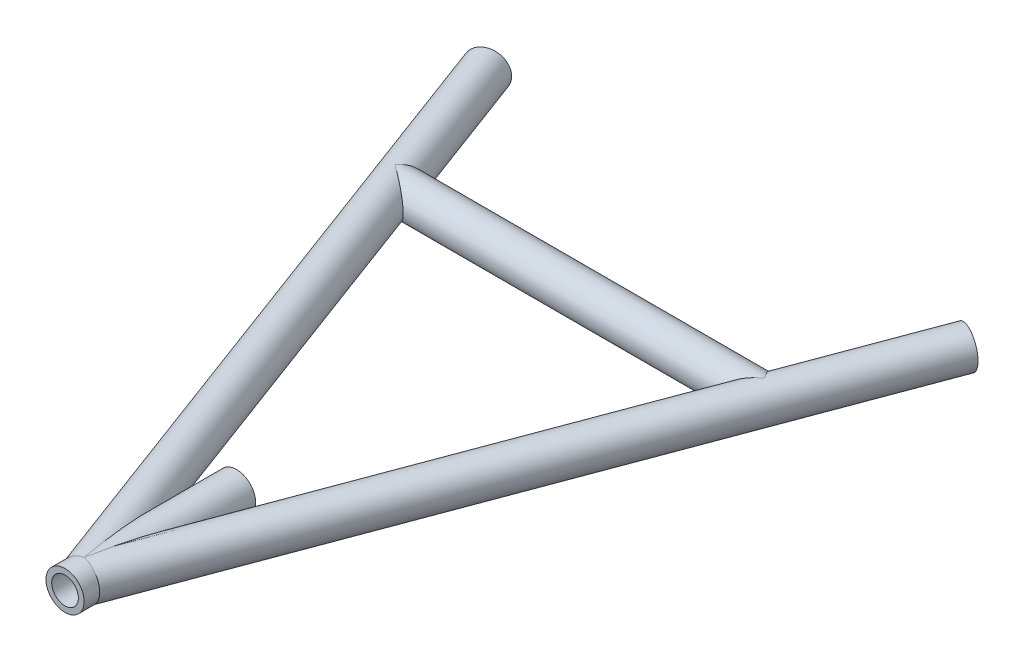
ISO-10303-21;
HEADER;
FILE_DESCRIPTION(('STEP AP214'),'2;1');
FILE_NAME('part.step','',(''),(''),'','','');
FILE_SCHEMA(('AUTOMOTIVE_DESIGN { 1 0 10303 214 1 1 1 1 }'));
ENDSEC;
DATA;
#1=APPLICATION_CONTEXT('core data for automotive mechanical design processes');
#2=APPLICATION_PROTOCOL_DEFINITION('international standard','automotive_design',2000,#1);
#3=PRODUCT_CONTEXT('',#1,'mechanical');
#4=PRODUCT('Part','Part','',(#3));
#5=PRODUCT_RELATED_PRODUCT_CATEGORY('part','',(#4));
#6=PRODUCT_DEFINITION_FORMATION('','',#4);
#7=PRODUCT_DEFINITION_CONTEXT('part definition',#1,'design');
#8=PRODUCT_DEFINITION('design','',#6,#7);
#9=PRODUCT_DEFINITION_SHAPE('','',#8);
#10=(LENGTH_UNIT() NAMED_UNIT(*) SI_UNIT(.MILLI.,.METRE.));
#11=(NAMED_UNIT(*) PLANE_ANGLE_UNIT() SI_UNIT($,.RADIAN.));
#12=(NAMED_UNIT(*) SI_UNIT($,.STERADIAN.) SOLID_ANGLE_UNIT());
#13=UNCERTAINTY_MEASURE_WITH_UNIT(LENGTH_MEASURE(1.E-05),#10,'distance_accuracy_value','');
#14=(GEOMETRIC_REPRESENTATION_CONTEXT(3) GLOBAL_UNCERTAINTY_ASSIGNED_CONTEXT((#13)) GLOBAL_UNIT_ASSIGNED_CONTEXT((#10,
#11,#12)) REPRESENTATION_CONTEXT('',''));
#15=CARTESIAN_POINT('',(0.,0.,0.));
#16=DIRECTION('',(0.,0.,1.));
#17=DIRECTION('',(1.,0.,0.));
#18=AXIS2_PLACEMENT_3D('',#15,#16,#17);
#19=CARTESIAN_POINT('',(5.,0.,4.99999999999998));
#20=DIRECTION('',(0.,0.,1.));
#21=DIRECTION('',(1.,0.,0.));
#22=AXIS2_PLACEMENT_3D('',#19,#20,#21);
#23=PLANE('',#22);
#24=CARTESIAN_POINT('',(0.,0.,4.99999999999998));
#25=DIRECTION('',(0.,0.,1.));
#26=DIRECTION('',(1.,0.,0.));
#27=AXIS2_PLACEMENT_3D('',#24,#25,#26);
#28=CIRCLE('',#27,3.5);
#29=CARTESIAN_POINT('',(3.49999999999996,0.,4.99999999999998));
#30=VERTEX_POINT('',#29);
#31=EDGE_CURVE('E187',#30,#30,#28,.T.);
#32=ORIENTED_EDGE('',*,*,#31,.F.);
#33=EDGE_LOOP('',(#32));
#34=FACE_BOUND('',#33,.T.);
#35=CARTESIAN_POINT('',(0.,0.,4.99999999999998));
#36=DIRECTION('',(0.,0.,1.));
#37=DIRECTION('',(1.,0.,0.));
#38=AXIS2_PLACEMENT_3D('',#35,#36,#37);
#39=CIRCLE('',#38,5.);
#40=CARTESIAN_POINT('',(5.,0.,4.99999999999998));
#41=VERTEX_POINT('',#40);
#42=EDGE_CURVE('E124',#41,#41,#39,.T.);
#43=ORIENTED_EDGE('',*,*,#42,.T.);
#44=EDGE_LOOP('',(#43));
#45=FACE_BOUND('',#44,.T.);
#46=ADVANCED_FACE('F66',(#34,#45),#23,.T.);
#47=CARTESIAN_POINT('',(-62.9177954880747,0.,-168.645637390716));
#48=DIRECTION('',(0.349543308267082,0.,0.936920207726199));
#49=DIRECTION('',(0.936920207726199,0.,-0.349543308267082));
#50=AXIS2_PLACEMENT_3D('',#47,#48,#49);
#51=PLANE('',#50);
#52=CARTESIAN_POINT('',(-62.9177954880747,0.,-168.645637390716));
#53=DIRECTION('',(-0.349543308267082,0.,-0.936920207726199));
#54=DIRECTION('',(-0.936920207726199,0.,0.349543308267082));
#55=AXIS2_PLACEMENT_3D('',#52,#53,#54);
#56=CIRCLE('',#55,3.50000000000001);
#57=CARTESIAN_POINT('',(-66.1970162151164,0.,-167.422235811781));
#58=VERTEX_POINT('',#57);
#59=EDGE_CURVE('E191',#58,#58,#56,.T.);
#60=ORIENTED_EDGE('',*,*,#59,.F.);
#61=EDGE_LOOP('',(#60));
#62=FACE_BOUND('',#61,.T.);
#63=CARTESIAN_POINT('',(-62.9177954880747,0.,-168.645637390716));
#64=DIRECTION('',(0.349543308267082,0.,0.936920207726199));
#65=DIRECTION('',(0.936920207726199,0.,-0.349543308267082));
#66=AXIS2_PLACEMENT_3D('',#63,#64,#65);
#67=CIRCLE('',#66,5.);
#68=CARTESIAN_POINT('',(-58.2331944494438,0.,-170.393353932051));
#69=VERTEX_POINT('',#68);
#70=EDGE_CURVE('E111',#69,#69,#67,.T.);
#71=ORIENTED_EDGE('',*,*,#70,.F.);
#72=EDGE_LOOP('',(#71));
#73=FACE_BOUND('',#72,.T.);
#74=ADVANCED_FACE('F104',(#62,#73),#51,.F.);
#75=CARTESIAN_POINT('',(5.1880154733208,0.,13.9060208563238));
#76=DIRECTION('',(-0.349543308267082,0.,-0.936920207726199));
#77=DIRECTION('',(-0.936920207726199,0.,0.349543308267082));
#78=AXIS2_PLACEMENT_3D('',#75,#76,#77);
#79=CYLINDRICAL_SURFACE('',#78,5.);
#80=CARTESIAN_POINT('',(-48.5,0.,-130.));
#81=DIRECTION('',(0.570287949957264,0.,-0.821444857634121));
#82=DIRECTION('',(-0.821444857634121,0.,-0.570287949957264));
#83=AXIS2_PLACEMENT_3D('',#80,#81,#82);
#84=ELLIPSE('',#83,8.76750069920764,5.);
#85=CARTESIAN_POINT('',(-48.5,-5.,-130.));
#86=VERTEX_POINT('',#85);
#87=CARTESIAN_POINT('',(-48.5,5.,-130.));
#88=VERTEX_POINT('',#87);
#89=EDGE_CURVE('E13',#86,#88,#84,.F.);
#90=ORIENTED_EDGE('',*,*,#89,.T.);
#91=CARTESIAN_POINT('',(-48.5,0.,-130.));
#92=DIRECTION('',(-0.821444857634121,0.,-0.570287949957264));
#93=DIRECTION('',(0.570287949957264,0.,-0.821444857634121));
#94=AXIS2_PLACEMENT_3D('',#91,#92,#93);
#95=ELLIPSE('',#94,6.08683583996219,5.);
#96=EDGE_CURVE('E75',#88,#86,#95,.T.);
#97=ORIENTED_EDGE('',*,*,#96,.T.);
#98=EDGE_LOOP('',(#90,#97));
#99=FACE_BOUND('',#98,.T.);
#100=CARTESIAN_POINT('',(0.,0.,0.));
#101=DIRECTION('',(-0.177594752560149,0.,-0.984103705847661));
#102=DIRECTION('',(-0.984103705847661,0.,0.177594752560149));
#103=AXIS2_PLACEMENT_3D('',#100,#101,#102);
#104=ELLIPSE('',#103,5.08076534036952,5.);
#105=CARTESIAN_POINT('',(0.,-5.,1.87350135405495E-13));
#106=VERTEX_POINT('',#105);
#107=CARTESIAN_POINT('',(0.,5.,0.));
#108=VERTEX_POINT('',#107);
#109=EDGE_CURVE('E108',#106,#108,#104,.T.);
#110=ORIENTED_EDGE('',*,*,#109,.T.);
#111=CARTESIAN_POINT('',(0.,0.,0.));
#112=DIRECTION('',(-0.984103705847661,0.,0.177594752560149));
#113=DIRECTION('',(-0.177594752560149,0.,-0.984103705847661));
#114=AXIS2_PLACEMENT_3D('',#111,#112,#113);
#115=ELLIPSE('',#114,28.1539850019305,5.);
#116=EDGE_CURVE('E113',#108,#106,#115,.T.);
#117=ORIENTED_EDGE('',*,*,#116,.T.);
#118=EDGE_LOOP('',(#110,#117));
#119=FACE_BOUND('',#118,.T.);
#120=ORIENTED_EDGE('',*,*,#70,.T.);
#121=EDGE_LOOP('',(#120));
#122=FACE_BOUND('',#121,.T.);
#123=ADVANCED_FACE('F68',(#99,#119,#122),#79,.T.);
#124=CARTESIAN_POINT('',(0.,0.,-40.));
#125=DIRECTION('',(0.,0.,1.));
#126=DIRECTION('',(1.,0.,0.));
#127=AXIS2_PLACEMENT_3D('',#124,#125,#126);
#128=PLANE('',#127);
#129=CARTESIAN_POINT('',(0.,0.,-40.));
#130=DIRECTION('',(0.,0.,1.));
#131=DIRECTION('',(1.,0.,0.));
#132=AXIS2_PLACEMENT_3D('',#129,#130,#131);
#133=CIRCLE('',#132,3.5);
#134=CARTESIAN_POINT('',(3.49999999999996,0.,-40.));
#135=VERTEX_POINT('',#134);
#136=EDGE_CURVE('E70',#135,#135,#133,.T.);
#137=ORIENTED_EDGE('',*,*,#136,.T.);
#138=EDGE_LOOP('',(#137));
#139=FACE_BOUND('',#138,.T.);
#140=CARTESIAN_POINT('',(0.,0.,-40.));
#141=DIRECTION('',(0.,0.,1.));
#142=DIRECTION('',(1.,0.,0.));
#143=AXIS2_PLACEMENT_3D('',#140,#141,#142);
#144=CIRCLE('',#143,5.);
#145=CARTESIAN_POINT('',(5.,0.,-40.));
#146=VERTEX_POINT('',#145);
#147=EDGE_CURVE('E99',#146,#146,#144,.T.);
#148=ORIENTED_EDGE('',*,*,#147,.F.);
#149=EDGE_LOOP('',(#148));
#150=FACE_BOUND('',#149,.T.);
#151=ADVANCED_FACE('F103',(#139,#150),#128,.F.);
#152=CARTESIAN_POINT('',(0.,0.,-40.));
#153=DIRECTION('',(0.,0.,1.));
#154=DIRECTION('',(1.,0.,0.));
#155=AXIS2_PLACEMENT_3D('',#152,#153,#154);
#156=CYLINDRICAL_SURFACE('',#155,5.);
#157=ORIENTED_EDGE('',*,*,#147,.T.);
#158=EDGE_LOOP('',(#157));
#159=FACE_BOUND('',#158,.T.);
#160=ORIENTED_EDGE('',*,*,#116,.F.);
#161=CARTESIAN_POINT('',(0.,0.,1.87350135405495E-13));
#162=DIRECTION('',(-0.984103705847661,0.,-0.177594752560149));
#163=DIRECTION('',(-0.177594752560149,0.,0.984103705847661));
#164=AXIS2_PLACEMENT_3D('',#161,#162,#163);
#165=ELLIPSE('',#164,28.1539850019305,5.);
#166=EDGE_CURVE('E118',#106,#108,#165,.F.);
#167=ORIENTED_EDGE('',*,*,#166,.F.);
#168=EDGE_LOOP('',(#160,#167));
#169=FACE_BOUND('',#168,.T.);
#170=ADVANCED_FACE('F130',(#159,#169),#156,.T.);
#171=ORIENTED_EDGE('',*,*,#42,.F.);
#172=EDGE_LOOP('',(#171));
#173=FACE_BOUND('',#172,.T.);
#174=ORIENTED_EDGE('',*,*,#109,.F.);
#175=CARTESIAN_POINT('',(0.,0.,1.87350135405495E-13));
#176=DIRECTION('',(-0.177594752560149,0.,0.984103705847661));
#177=DIRECTION('',(-0.984103705847661,0.,-0.177594752560149));
#178=AXIS2_PLACEMENT_3D('',#175,#176,#177);
#179=ELLIPSE('',#178,5.08076534036952,5.);
#180=EDGE_CURVE('E181',#108,#106,#179,.F.);
#181=ORIENTED_EDGE('',*,*,#180,.F.);
#182=EDGE_LOOP('',(#174,#181));
#183=FACE_BOUND('',#182,.T.);
#184=ADVANCED_FACE('F141',(#173,#183),#156,.T.);
#185=CARTESIAN_POINT('',(62.9177954880747,0.,-168.645637390716));
#186=DIRECTION('',(0.349543308267082,0.,-0.936920207726199));
#187=DIRECTION('',(-0.936920207726199,0.,-0.349543308267082));
#188=AXIS2_PLACEMENT_3D('',#185,#186,#187);
#189=PLANE('',#188);
#190=CARTESIAN_POINT('',(62.9177954880748,0.,-168.645637390716));
#191=DIRECTION('',(0.349543308267082,0.,-0.936920207726199));
#192=DIRECTION('',(-0.936920207726199,0.,-0.349543308267082));
#193=AXIS2_PLACEMENT_3D('',#190,#191,#192);
#194=CIRCLE('',#193,3.49999999999998);
#195=CARTESIAN_POINT('',(59.6385747610331,0.,-169.869038969651));
#196=VERTEX_POINT('',#195);
#197=EDGE_CURVE('E173',#196,#196,#194,.T.);
#198=ORIENTED_EDGE('',*,*,#197,.F.);
#199=EDGE_LOOP('',(#198));
#200=FACE_BOUND('',#199,.T.);
#201=CARTESIAN_POINT('',(62.9177954880747,0.,-168.645637390716));
#202=DIRECTION('',(0.349543308267082,0.,-0.936920207726199));
#203=DIRECTION('',(-0.936920207726199,0.,-0.349543308267082));
#204=AXIS2_PLACEMENT_3D('',#201,#202,#203);
#205=CIRCLE('',#204,5.);
#206=CARTESIAN_POINT('',(58.2331944494437,0.,-170.393353932051));
#207=VERTEX_POINT('',#206);
#208=EDGE_CURVE('E114',#207,#207,#205,.T.);
#209=ORIENTED_EDGE('',*,*,#208,.T.);
#210=EDGE_LOOP('',(#209));
#211=FACE_BOUND('',#210,.T.);
#212=ADVANCED_FACE('F158',(#200,#211),#189,.T.);
#213=CARTESIAN_POINT('',(62.9177954880747,0.,-168.645637390716));
#214=DIRECTION('',(-0.349543308267082,0.,0.936920207726199));
#215=DIRECTION('',(0.936920207726199,0.,0.349543308267082));
#216=AXIS2_PLACEMENT_3D('',#213,#214,#215);
#217=CYLINDRICAL_SURFACE('',#216,5.);
#218=CARTESIAN_POINT('',(48.5,0.,-130.));
#219=DIRECTION('',(0.570287949957264,0.,0.821444857634121));
#220=DIRECTION('',(-0.821444857634121,0.,0.570287949957264));
#221=AXIS2_PLACEMENT_3D('',#218,#219,#220);
#222=ELLIPSE('',#221,8.76750069920764,5.);
#223=CARTESIAN_POINT('',(48.5,5.,-130.));
#224=VERTEX_POINT('',#223);
#225=CARTESIAN_POINT('',(48.5,-5.,-130.));
#226=VERTEX_POINT('',#225);
#227=EDGE_CURVE('E86',#224,#226,#222,.T.);
#228=ORIENTED_EDGE('',*,*,#227,.T.);
#229=CARTESIAN_POINT('',(48.5,0.,-130.));
#230=DIRECTION('',(-0.821444857634121,0.,0.570287949957264));
#231=DIRECTION('',(0.570287949957264,0.,0.821444857634121));
#232=AXIS2_PLACEMENT_3D('',#229,#230,#231);
#233=ELLIPSE('',#232,6.08683583996219,5.);
#234=EDGE_CURVE('E183',#226,#224,#233,.F.);
#235=ORIENTED_EDGE('',*,*,#234,.T.);
#236=EDGE_LOOP('',(#228,#235));
#237=FACE_BOUND('',#236,.T.);
#238=ORIENTED_EDGE('',*,*,#208,.F.);
#239=EDGE_LOOP('',(#238));
#240=FACE_BOUND('',#239,.T.);
#241=ORIENTED_EDGE('',*,*,#166,.T.);
#242=ORIENTED_EDGE('',*,*,#180,.T.);
#243=EDGE_LOOP('',(#241,#242));
#244=FACE_BOUND('',#243,.T.);
#245=ADVANCED_FACE('F160',(#237,#240,#244),#217,.T.);
#246=CARTESIAN_POINT('',(48.5,0.,-130.));
#247=DIRECTION('',(-1.,0.,0.));
#248=DIRECTION('',(0.,0.,1.));
#249=AXIS2_PLACEMENT_3D('',#246,#247,#248);
#250=CYLINDRICAL_SURFACE('',#249,5.);
#251=ORIENTED_EDGE('',*,*,#234,.F.);
#252=ORIENTED_EDGE('',*,*,#227,.F.);
#253=EDGE_LOOP('',(#251,#252));
#254=FACE_BOUND('',#253,.T.);
#255=ORIENTED_EDGE('',*,*,#96,.F.);
#256=ORIENTED_EDGE('',*,*,#89,.F.);
#257=EDGE_LOOP('',(#255,#256));
#258=FACE_BOUND('',#257,.T.);
#259=ADVANCED_FACE('F97',(#254,#258),#250,.T.);
#260=CARTESIAN_POINT('',(0.,0.,-44.));
#261=DIRECTION('',(0.,0.,1.));
#262=DIRECTION('',(1.,0.,0.));
#263=AXIS2_PLACEMENT_3D('',#260,#261,#262);
#264=CYLINDRICAL_SURFACE('',#263,3.5);
#265=CARTESIAN_POINT('',(3.49999999999996,0.,4.99999999999998));
#266=CARTESIAN_POINT('',(3.49999999999996,0.,4.53124999999998));
#267=CARTESIAN_POINT('',(3.49999999999996,0.,4.06249999999998));
#268=CARTESIAN_POINT('',(3.49999999999996,0.,3.12499999999998));
#269=CARTESIAN_POINT('',(3.49999999999996,0.,2.65624999999998));
#270=CARTESIAN_POINT('',(3.49999999999996,0.,1.71874999999998));
#271=CARTESIAN_POINT('',(3.49999999999996,0.,1.24999999999998));
#272=CARTESIAN_POINT('',(3.49999999999996,0.,0.312499999999984));
#273=CARTESIAN_POINT('',(3.49999999999996,0.,-0.156250000000015));
#274=CARTESIAN_POINT('',(3.49999999999996,0.,-1.09375000000001));
#275=CARTESIAN_POINT('',(3.49999999999996,0.,-1.56250000000001));
#276=CARTESIAN_POINT('',(3.49999999999996,0.,-2.50000000000001));
#277=CARTESIAN_POINT('',(3.49999999999996,0.,-2.96875000000002));
#278=CARTESIAN_POINT('',(3.49999999999996,0.,-3.90625000000002));
#279=CARTESIAN_POINT('',(3.49999999999996,0.,-4.37500000000002));
#280=CARTESIAN_POINT('',(3.49999999999996,0.,-5.31250000000001));
#281=CARTESIAN_POINT('',(3.49999999999996,0.,-5.78125000000001));
#282=CARTESIAN_POINT('',(3.49999999999996,0.,-6.71875000000001));
#283=CARTESIAN_POINT('',(3.49999999999996,0.,-7.18750000000001));
#284=CARTESIAN_POINT('',(3.49999999999996,0.,-8.12500000000001));
#285=CARTESIAN_POINT('',(3.49999999999996,0.,-8.59375000000001));
#286=CARTESIAN_POINT('',(3.49999999999996,0.,-9.53125000000001));
#287=CARTESIAN_POINT('',(3.49999999999996,0.,-10.));
#288=CARTESIAN_POINT('',(3.49999999999996,0.,-10.9375));
#289=CARTESIAN_POINT('',(3.49999999999996,0.,-11.40625));
#290=CARTESIAN_POINT('',(3.49999999999996,0.,-12.34375));
#291=CARTESIAN_POINT('',(3.49999999999996,0.,-12.8125));
#292=CARTESIAN_POINT('',(3.49999999999996,0.,-13.75));
#293=CARTESIAN_POINT('',(3.49999999999996,0.,-14.21875));
#294=CARTESIAN_POINT('',(3.49999999999996,0.,-15.15625));
#295=CARTESIAN_POINT('',(3.49999999999996,0.,-15.625));
#296=CARTESIAN_POINT('',(3.49999999999996,0.,-16.5625));
#297=CARTESIAN_POINT('',(3.49999999999996,0.,-17.03125));
#298=CARTESIAN_POINT('',(3.49999999999996,0.,-17.96875));
#299=CARTESIAN_POINT('',(3.49999999999996,0.,-18.4375));
#300=CARTESIAN_POINT('',(3.49999999999996,0.,-19.375));
#301=CARTESIAN_POINT('',(3.49999999999996,0.,-19.84375));
#302=CARTESIAN_POINT('',(3.49999999999996,0.,-20.78125));
#303=CARTESIAN_POINT('',(3.49999999999996,0.,-21.25));
#304=CARTESIAN_POINT('',(3.49999999999996,0.,-22.1875));
#305=CARTESIAN_POINT('',(3.49999999999996,0.,-22.65625));
#306=CARTESIAN_POINT('',(3.49999999999996,0.,-23.59375));
#307=CARTESIAN_POINT('',(3.49999999999996,0.,-24.0625));
#308=CARTESIAN_POINT('',(3.49999999999996,0.,-25.));
#309=CARTESIAN_POINT('',(3.49999999999996,0.,-25.46875));
#310=CARTESIAN_POINT('',(3.49999999999996,0.,-26.40625));
#311=CARTESIAN_POINT('',(3.49999999999996,0.,-26.875));
#312=CARTESIAN_POINT('',(3.49999999999996,0.,-27.8125));
#313=CARTESIAN_POINT('',(3.49999999999996,0.,-28.28125));
#314=CARTESIAN_POINT('',(3.49999999999996,0.,-29.21875));
#315=CARTESIAN_POINT('',(3.49999999999996,0.,-29.6875));
#316=CARTESIAN_POINT('',(3.49999999999996,0.,-30.625));
#317=CARTESIAN_POINT('',(3.49999999999996,0.,-31.09375));
#318=CARTESIAN_POINT('',(3.49999999999996,0.,-32.03125));
#319=CARTESIAN_POINT('',(3.49999999999996,0.,-32.5));
#320=CARTESIAN_POINT('',(3.49999999999996,0.,-33.4375));
#321=CARTESIAN_POINT('',(3.49999999999996,0.,-33.90625));
#322=CARTESIAN_POINT('',(3.49999999999996,0.,-34.84375));
#323=CARTESIAN_POINT('',(3.49999999999996,0.,-35.3125));
#324=CARTESIAN_POINT('',(3.49999999999996,0.,-36.25));
#325=CARTESIAN_POINT('',(3.49999999999996,0.,-36.71875));
#326=CARTESIAN_POINT('',(3.49999999999996,0.,-37.65625));
#327=CARTESIAN_POINT('',(3.49999999999996,0.,-38.125));
#328=CARTESIAN_POINT('',(3.49999999999996,0.,-39.0625));
#329=CARTESIAN_POINT('',(3.49999999999996,0.,-39.53125));
#330=CARTESIAN_POINT('',(3.49999999999996,0.,-40.));
#331=B_SPLINE_CURVE_WITH_KNOTS('',3,(#265,#266,#267,#268,#269,#270,#271,#272,#273,#274,#275,
#276,#277,#278,#279,#280,#281,#282,#283,#284,#285,#286,#287,#288,#289,#290,#291,#292,#293,#294,
#295,#296,#297,#298,#299,#300,#301,#302,#303,#304,#305,#306,#307,#308,#309,#310,#311,#312,#313,
#314,#315,#316,#317,#318,#319,#320,#321,#322,#323,#324,#325,#326,#327,#328,#329,#330),
.UNSPECIFIED.,.F.,.F.,(4,2,2,2,2,2,2,2,2,2,2,2,2,2,2,2,2,2,2,2,2,2,2,2,2,2,2,2,2,2,2,2,4),(0.,
1.40625,2.8125,4.21875,5.625,7.03125,8.4375,9.84375,11.25,12.65625,14.0625,15.46875,16.875,
18.28125,19.6875,21.09375,22.5,23.90625,25.3125,26.71875,28.125,29.53125,30.9375,32.34375,33.75,
35.15625,36.5625,37.96875,39.375,40.78125,42.1875,43.59375,45.),.UNSPECIFIED.);
#332=EDGE_CURVE('BSEAM154',#30,#135,#331,.T.);
#333=ORIENTED_EDGE('',*,*,#31,.T.);
#334=ORIENTED_EDGE('',*,*,#136,.F.);
#335=ORIENTED_EDGE('',*,*,#332,.T.);
#336=ORIENTED_EDGE('',*,*,#332,.F.);
#337=EDGE_LOOP('',(#333,#335,#334,#336));
#338=FACE_BOUND('',#337,.T.);
#339=ADVANCED_FACE('F154',(#338),#264,.F.);
#340=CARTESIAN_POINT('',(-16.7780787968199,0.,-44.9721699708575));
#341=DIRECTION('',(-0.349543308267082,0.,-0.936920207726199));
#342=DIRECTION('',(-0.936920207726199,0.,0.349543308267082));
#343=AXIS2_PLACEMENT_3D('',#340,#341,#342);
#344=CYLINDRICAL_SURFACE('',#343,3.50000000000001);
#345=CARTESIAN_POINT('',(-16.7780787968199,0.,-44.9721699708575));
#346=DIRECTION('',(-0.349543308267082,0.,-0.936920207726199));
#347=DIRECTION('',(-0.936920207726199,0.,0.349543308267082));
#348=AXIS2_PLACEMENT_3D('',#345,#346,#347);
#349=CIRCLE('',#348,3.50000000000001);
#350=CARTESIAN_POINT('',(-20.0572995238616,0.,-43.7487683919227));
#351=VERTEX_POINT('',#350);
#352=EDGE_CURVE('E190',#351,#351,#349,.T.);
#353=CARTESIAN_POINT('',(-20.0572995238616,0.,-43.7487683919227));
#354=CARTESIAN_POINT('',(-20.5379215727289,0.,-45.0370336775463));
#355=CARTESIAN_POINT('',(-21.0185436215961,0.,-46.3252989631698));
#356=CARTESIAN_POINT('',(-21.9797877193306,0.,-48.9018295344168));
#357=CARTESIAN_POINT('',(-22.4604097681978,0.,-50.1900948200404));
#358=CARTESIAN_POINT('',(-23.4216538659323,0.,-52.7666253912874));
#359=CARTESIAN_POINT('',(-23.9022759147995,0.,-54.0548906769109));
#360=CARTESIAN_POINT('',(-24.863520012534,0.,-56.631421248158));
#361=CARTESIAN_POINT('',(-25.3441420614012,0.,-57.9196865337815));
#362=CARTESIAN_POINT('',(-26.3053861591357,0.,-60.4962171050286));
#363=CARTESIAN_POINT('',(-26.7860082080029,0.,-61.7844823906521));
#364=CARTESIAN_POINT('',(-27.7472523057374,0.,-64.3610129618991));
#365=CARTESIAN_POINT('',(-28.2278743546047,0.,-65.6492782475226));
#366=CARTESIAN_POINT('',(-29.1891184523391,0.,-68.2258088187697));
#367=CARTESIAN_POINT('',(-29.6697405012064,0.,-69.5140741043932));
#368=CARTESIAN_POINT('',(-30.6309845989408,0.,-72.0906046756403));
#369=CARTESIAN_POINT('',(-31.1116066478081,0.,-73.3788699612638));
#370=CARTESIAN_POINT('',(-32.0728507455426,0.,-75.9554005325108));
#371=CARTESIAN_POINT('',(-32.5534727944098,0.,-77.2436658181344));
#372=CARTESIAN_POINT('',(-33.5147168921443,0.,-79.8201963893814));
#373=CARTESIAN_POINT('',(-33.9953389410115,0.,-81.1084616750049));
#374=CARTESIAN_POINT('',(-34.956583038746,0.,-83.684992246252));
#375=CARTESIAN_POINT('',(-35.4372050876132,0.,-84.9732575318755));
#376=CARTESIAN_POINT('',(-36.3984491853477,0.,-87.5497881031225));
#377=CARTESIAN_POINT('',(-36.8790712342149,0.,-88.8380533887461));
#378=CARTESIAN_POINT('',(-37.8403153319494,0.,-91.4145839599931));
#379=CARTESIAN_POINT('',(-38.3209373808167,0.,-92.7028492456166));
#380=CARTESIAN_POINT('',(-39.2821814785511,0.,-95.2793798168637));
#381=CARTESIAN_POINT('',(-39.7628035274183,0.,-96.5676451024872));
#382=CARTESIAN_POINT('',(-40.7240476251528,0.,-99.1441756737343));
#383=CARTESIAN_POINT('',(-41.2046696740201,0.,-100.432440959358));
#384=CARTESIAN_POINT('',(-42.1659137717545,0.,-103.008971530605));
#385=CARTESIAN_POINT('',(-42.6465358206218,0.,-104.297236816228));
#386=CARTESIAN_POINT('',(-43.6077799183563,0.,-106.873767387475));
#387=CARTESIAN_POINT('',(-44.0884019672235,0.,-108.162032673099));
#388=CARTESIAN_POINT('',(-45.049646064958,0.,-110.738563244346));
#389=CARTESIAN_POINT('',(-45.5302681138252,0.,-112.02682852997));
#390=CARTESIAN_POINT('',(-46.4915122115597,0.,-114.603359101217));
#391=CARTESIAN_POINT('',(-46.9721342604269,0.,-115.89162438684));
#392=CARTESIAN_POINT('',(-47.9333783581614,0.,-118.468154958087));
#393=CARTESIAN_POINT('',(-48.4140004070286,0.,-119.756420243711));
#394=CARTESIAN_POINT('',(-49.3752445047631,0.,-122.332950814958));
#395=CARTESIAN_POINT('',(-49.8558665536303,0.,-123.621216100581));
#396=CARTESIAN_POINT('',(-50.8171106513648,0.,-126.197746671828));
#397=CARTESIAN_POINT('',(-51.2977327002321,0.,-127.486011957452));
#398=CARTESIAN_POINT('',(-52.2589767979665,0.,-130.062542528699));
#399=CARTESIAN_POINT('',(-52.7395988468338,0.,-131.350807814322));
#400=CARTESIAN_POINT('',(-53.7008429445683,0.,-133.927338385569));
#401=CARTESIAN_POINT('',(-54.1814649934355,0.,-135.215603671193));
#402=CARTESIAN_POINT('',(-55.14270909117,0.,-137.79213424244));
#403=CARTESIAN_POINT('',(-55.6233311400372,0.,-139.080399528064));
#404=CARTESIAN_POINT('',(-56.5845752377717,0.,-141.656930099311));
#405=CARTESIAN_POINT('',(-57.0651972866389,0.,-142.945195384934));
#406=CARTESIAN_POINT('',(-58.0264413843734,0.,-145.521725956181));
#407=CARTESIAN_POINT('',(-58.5070634332406,0.,-146.809991241805));
#408=CARTESIAN_POINT('',(-59.4683075309751,0.,-149.386521813052));
#409=CARTESIAN_POINT('',(-59.9489295798423,0.,-150.674787098675));
#410=CARTESIAN_POINT('',(-60.9101736775768,0.,-153.251317669922));
#411=CARTESIAN_POINT('',(-61.390795726444,0.,-154.539582955546));
#412=CARTESIAN_POINT('',(-62.3520398241785,0.,-157.116113526793));
#413=CARTESIAN_POINT('',(-62.8326618730458,0.,-158.404378812416));
#414=CARTESIAN_POINT('',(-63.7939059707802,0.,-160.980909383663));
#415=CARTESIAN_POINT('',(-64.2745280196475,0.,-162.269174669287));
#416=CARTESIAN_POINT('',(-65.235772117382,0.,-164.845705240534));
#417=CARTESIAN_POINT('',(-65.7163941662492,0.,-166.133970526157));
#418=CARTESIAN_POINT('',(-66.1970162151164,0.,-167.422235811781));
#419=B_SPLINE_CURVE_WITH_KNOTS('',3,(#353,#354,#355,#356,#357,#358,#359,#360,#361,#362,#363,
#364,#365,#366,#367,#368,#369,#370,#371,#372,#373,#374,#375,#376,#377,#378,#379,#380,#381,#382,
#383,#384,#385,#386,#387,#388,#389,#390,#391,#392,#393,#394,#395,#396,#397,#398,#399,#400,#401,
#402,#403,#404,#405,#406,#407,#408,#409,#410,#411,#412,#413,#414,#415,#416,#417,#418),
.UNSPECIFIED.,.F.,.F.,(4,2,2,2,2,2,2,2,2,2,2,2,2,2,2,2,2,2,2,2,2,2,2,2,2,2,2,2,2,2,2,2,4),(0.,
4.12499999999999,8.25,12.375,16.5,20.625,24.75,28.875,33.,37.125,41.25,45.375,49.5,53.625,57.75,
61.875,66.,70.125,74.25,78.375,82.5,86.625,90.75,94.875,99.,103.125,107.25,111.375,115.5,
119.625,123.75,127.875,132.),.UNSPECIFIED.);
#420=EDGE_CURVE('BSEAM211',#351,#58,#419,.T.);
#421=ORIENTED_EDGE('',*,*,#352,.F.);
#422=ORIENTED_EDGE('',*,*,#59,.T.);
#423=ORIENTED_EDGE('',*,*,#420,.T.);
#424=ORIENTED_EDGE('',*,*,#420,.F.);
#425=EDGE_LOOP('',(#421,#423,#422,#424));
#426=FACE_BOUND('',#425,.T.);
#427=ADVANCED_FACE('F211',(#426),#344,.F.);
#428=CARTESIAN_POINT('',(-16.7780787968199,0.,-44.9721699708575));
#429=DIRECTION('',(-0.349543308267082,0.,-0.936920207726199));
#430=DIRECTION('',(-0.936920207726199,0.,0.349543308267082));
#431=AXIS2_PLACEMENT_3D('',#428,#429,#430);
#432=PLANE('',#431);
#433=ORIENTED_EDGE('',*,*,#352,.T.);
#434=EDGE_LOOP('',(#433));
#435=FACE_BOUND('',#434,.T.);
#436=ADVANCED_FACE('F205',(#435),#432,.T.);
#437=CARTESIAN_POINT('',(16.77807879682,0.,-44.9721699708576));
#438=DIRECTION('',(0.349543308267082,0.,-0.936920207726199));
#439=DIRECTION('',(-0.936920207726199,0.,-0.349543308267082));
#440=AXIS2_PLACEMENT_3D('',#437,#438,#439);
#441=CYLINDRICAL_SURFACE('',#440,3.49999999999998);
#442=CARTESIAN_POINT('',(16.77807879682,0.,-44.9721699708576));
#443=DIRECTION('',(0.349543308267082,0.,-0.936920207726199));
#444=DIRECTION('',(-0.936920207726199,0.,-0.349543308267082));
#445=AXIS2_PLACEMENT_3D('',#442,#443,#444);
#446=CIRCLE('',#445,3.49999999999998);
#447=CARTESIAN_POINT('',(13.4988580697783,0.,-46.1955715497924));
#448=VERTEX_POINT('',#447);
#449=EDGE_CURVE('E194',#448,#448,#446,.T.);
#450=ORIENTED_EDGE('',*,*,#449,.F.);
#451=EDGE_LOOP('',(#450));
#452=FACE_BOUND('',#451,.T.);
#453=ORIENTED_EDGE('',*,*,#197,.T.);
#454=EDGE_LOOP('',(#453));
#455=FACE_BOUND('',#454,.T.);
#456=ADVANCED_FACE('F203',(#452,#455),#441,.F.);
#457=CARTESIAN_POINT('',(16.77807879682,0.,-44.9721699708576));
#458=DIRECTION('',(0.349543308267082,0.,-0.936920207726199));
#459=DIRECTION('',(-0.936920207726199,0.,-0.349543308267082));
#460=AXIS2_PLACEMENT_3D('',#457,#458,#459);
#461=PLANE('',#460);
#462=ORIENTED_EDGE('',*,*,#449,.T.);
#463=EDGE_LOOP('',(#462));
#464=FACE_BOUND('',#463,.T.);
#465=ADVANCED_FACE('F201',(#464),#461,.T.);
#466=CLOSED_SHELL('',(#46,#74,#123,#151,#170,#184,#212,#245,#259,#339,#427,#436,#456,#465));
#467=MANIFOLD_SOLID_BREP('B2',#466);
#468=ADVANCED_BREP_SHAPE_REPRESENTATION('',(#18,#467),#14);
#469=SHAPE_DEFINITION_REPRESENTATION(#9,#468);
ENDSEC;
END-ISO-10303-21;
